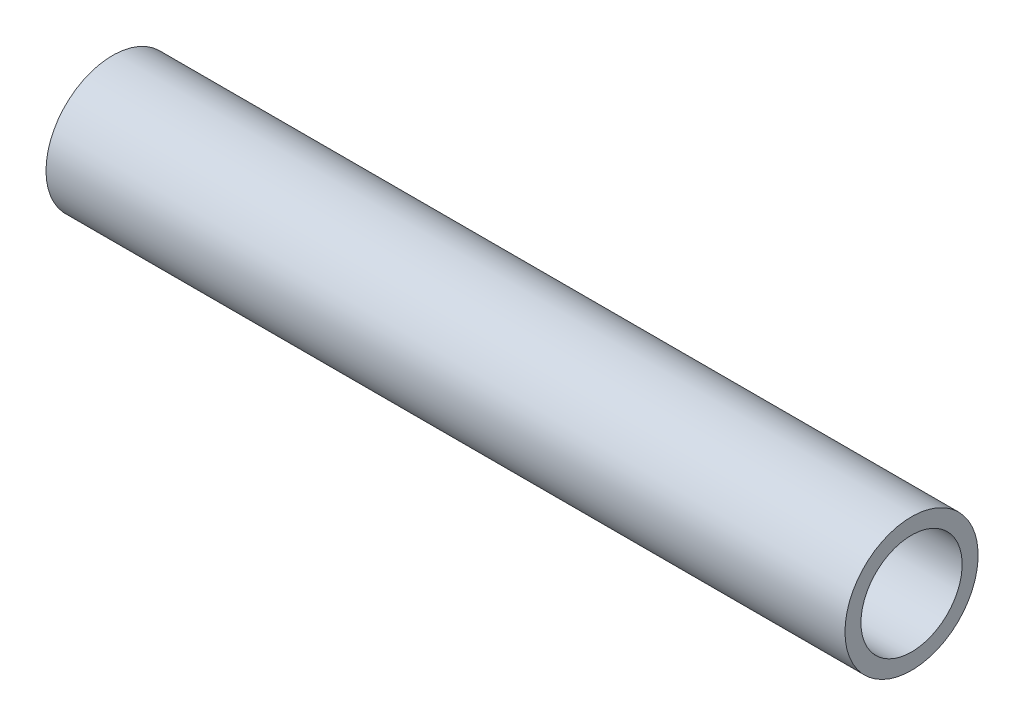
ISO-10303-21;
HEADER;
FILE_DESCRIPTION(('STEP AP214'),'2;1');
FILE_NAME('part.step','',(''),(''),'','','');
FILE_SCHEMA(('AUTOMOTIVE_DESIGN { 1 0 10303 214 1 1 1 1 }'));
ENDSEC;
DATA;
#1=APPLICATION_CONTEXT('core data for automotive mechanical design processes');
#2=APPLICATION_PROTOCOL_DEFINITION('international standard','automotive_design',2000,#1);
#3=PRODUCT_CONTEXT('',#1,'mechanical');
#4=PRODUCT('Part','Part','',(#3));
#5=PRODUCT_RELATED_PRODUCT_CATEGORY('part','',(#4));
#6=PRODUCT_DEFINITION_FORMATION('','',#4);
#7=PRODUCT_DEFINITION_CONTEXT('part definition',#1,'design');
#8=PRODUCT_DEFINITION('design','',#6,#7);
#9=PRODUCT_DEFINITION_SHAPE('','',#8);
#10=(LENGTH_UNIT() NAMED_UNIT(*) SI_UNIT(.MILLI.,.METRE.));
#11=(NAMED_UNIT(*) PLANE_ANGLE_UNIT() SI_UNIT($,.RADIAN.));
#12=(NAMED_UNIT(*) SI_UNIT($,.STERADIAN.) SOLID_ANGLE_UNIT());
#13=UNCERTAINTY_MEASURE_WITH_UNIT(LENGTH_MEASURE(1.E-05),#10,'distance_accuracy_value','');
#14=(GEOMETRIC_REPRESENTATION_CONTEXT(3) GLOBAL_UNCERTAINTY_ASSIGNED_CONTEXT((#13)) GLOBAL_UNIT_ASSIGNED_CONTEXT((#10,
#11,#12)) REPRESENTATION_CONTEXT('',''));
#15=CARTESIAN_POINT('',(0.,0.,0.));
#16=DIRECTION('',(0.,0.,1.));
#17=DIRECTION('',(1.,0.,0.));
#18=AXIS2_PLACEMENT_3D('',#15,#16,#17);
#19=CARTESIAN_POINT('',(152.4,0.,0.));
#20=DIRECTION('',(1.,0.,0.));
#21=DIRECTION('',(0.,0.,-1.));
#22=AXIS2_PLACEMENT_3D('',#19,#20,#21);
#23=PLANE('',#22);
#24=CARTESIAN_POINT('',(152.4,0.,0.));
#25=DIRECTION('',(1.,0.,0.));
#26=DIRECTION('',(0.,0.,-1.));
#27=AXIS2_PLACEMENT_3D('',#24,#25,#26);
#28=CIRCLE('',#27,12.7);
#29=CARTESIAN_POINT('',(152.4,0.,12.7));
#30=VERTEX_POINT('',#29);
#31=EDGE_CURVE('E10',#30,#30,#28,.T.);
#32=ORIENTED_EDGE('',*,*,#31,.T.);
#33=EDGE_LOOP('',(#32));
#34=FACE_BOUND('',#33,.T.);
#35=CARTESIAN_POINT('',(152.4,0.,0.));
#36=DIRECTION('',(1.,0.,0.));
#37=DIRECTION('',(0.,0.,-1.));
#38=AXIS2_PLACEMENT_3D('',#35,#36,#37);
#39=CIRCLE('',#38,9.652);
#40=CARTESIAN_POINT('',(152.4,0.,9.652));
#41=VERTEX_POINT('',#40);
#42=EDGE_CURVE('E50',#41,#41,#39,.T.);
#43=ORIENTED_EDGE('',*,*,#42,.F.);
#44=EDGE_LOOP('',(#43));
#45=FACE_BOUND('',#44,.T.);
#46=ADVANCED_FACE('F36',(#34,#45),#23,.T.);
#47=CARTESIAN_POINT('',(0.,0.,0.));
#48=DIRECTION('',(1.,0.,0.));
#49=DIRECTION('',(0.,0.,-1.));
#50=AXIS2_PLACEMENT_3D('',#47,#48,#49);
#51=PLANE('',#50);
#52=CARTESIAN_POINT('',(0.,0.,0.));
#53=DIRECTION('',(1.,0.,0.));
#54=DIRECTION('',(0.,0.,-1.));
#55=AXIS2_PLACEMENT_3D('',#52,#53,#54);
#56=CIRCLE('',#55,12.7);
#57=CARTESIAN_POINT('',(0.,0.,12.7));
#58=VERTEX_POINT('',#57);
#59=EDGE_CURVE('E40',#58,#58,#56,.T.);
#60=ORIENTED_EDGE('',*,*,#59,.F.);
#61=EDGE_LOOP('',(#60));
#62=FACE_BOUND('',#61,.T.);
#63=CARTESIAN_POINT('',(0.,0.,0.));
#64=DIRECTION('',(1.,0.,0.));
#65=DIRECTION('',(0.,0.,-1.));
#66=AXIS2_PLACEMENT_3D('',#63,#64,#65);
#67=CIRCLE('',#66,9.652);
#68=CARTESIAN_POINT('',(0.,0.,9.652));
#69=VERTEX_POINT('',#68);
#70=EDGE_CURVE('E52',#69,#69,#67,.T.);
#71=ORIENTED_EDGE('',*,*,#70,.T.);
#72=EDGE_LOOP('',(#71));
#73=FACE_BOUND('',#72,.T.);
#74=ADVANCED_FACE('F63',(#62,#73),#51,.F.);
#75=CARTESIAN_POINT('',(152.4,0.,0.));
#76=DIRECTION('',(-1.,0.,0.));
#77=DIRECTION('',(0.,0.,1.));
#78=AXIS2_PLACEMENT_3D('',#75,#76,#77);
#79=CYLINDRICAL_SURFACE('',#78,12.7);
#80=CARTESIAN_POINT('',(152.4,0.,12.7));
#81=CARTESIAN_POINT('',(150.8125,0.,12.7));
#82=CARTESIAN_POINT('',(149.225,0.,12.7));
#83=CARTESIAN_POINT('',(146.05,0.,12.7));
#84=CARTESIAN_POINT('',(144.4625,0.,12.7));
#85=CARTESIAN_POINT('',(141.2875,0.,12.7));
#86=CARTESIAN_POINT('',(139.7,0.,12.7));
#87=CARTESIAN_POINT('',(136.525,0.,12.7));
#88=CARTESIAN_POINT('',(134.9375,0.,12.7));
#89=CARTESIAN_POINT('',(131.7625,0.,12.7));
#90=CARTESIAN_POINT('',(130.175,0.,12.7));
#91=CARTESIAN_POINT('',(127.,0.,12.7));
#92=CARTESIAN_POINT('',(125.4125,0.,12.7));
#93=CARTESIAN_POINT('',(122.2375,0.,12.7));
#94=CARTESIAN_POINT('',(120.65,0.,12.7));
#95=CARTESIAN_POINT('',(117.475,0.,12.7));
#96=CARTESIAN_POINT('',(115.8875,0.,12.7));
#97=CARTESIAN_POINT('',(112.7125,0.,12.7));
#98=CARTESIAN_POINT('',(111.125,0.,12.7));
#99=CARTESIAN_POINT('',(107.95,0.,12.7));
#100=CARTESIAN_POINT('',(106.3625,0.,12.7));
#101=CARTESIAN_POINT('',(103.1875,0.,12.7));
#102=CARTESIAN_POINT('',(101.6,0.,12.7));
#103=CARTESIAN_POINT('',(98.425,0.,12.7));
#104=CARTESIAN_POINT('',(96.8375,0.,12.7));
#105=CARTESIAN_POINT('',(93.6625,0.,12.7));
#106=CARTESIAN_POINT('',(92.075,0.,12.7));
#107=CARTESIAN_POINT('',(88.9,0.,12.7));
#108=CARTESIAN_POINT('',(87.3125,0.,12.7));
#109=CARTESIAN_POINT('',(84.1375,0.,12.7));
#110=CARTESIAN_POINT('',(82.55,0.,12.7));
#111=CARTESIAN_POINT('',(79.375,0.,12.7));
#112=CARTESIAN_POINT('',(77.7875,0.,12.7));
#113=CARTESIAN_POINT('',(74.6125,0.,12.7));
#114=CARTESIAN_POINT('',(73.025,0.,12.7));
#115=CARTESIAN_POINT('',(69.85,0.,12.7));
#116=CARTESIAN_POINT('',(68.2625,0.,12.7));
#117=CARTESIAN_POINT('',(65.0875,0.,12.7));
#118=CARTESIAN_POINT('',(63.5,0.,12.7));
#119=CARTESIAN_POINT('',(60.325,0.,12.7));
#120=CARTESIAN_POINT('',(58.7375,0.,12.7));
#121=CARTESIAN_POINT('',(55.5625,0.,12.7));
#122=CARTESIAN_POINT('',(53.975,0.,12.7));
#123=CARTESIAN_POINT('',(50.8,0.,12.7));
#124=CARTESIAN_POINT('',(49.2125,0.,12.7));
#125=CARTESIAN_POINT('',(46.0375,0.,12.7));
#126=CARTESIAN_POINT('',(44.45,0.,12.7));
#127=CARTESIAN_POINT('',(41.275,0.,12.7));
#128=CARTESIAN_POINT('',(39.6875,0.,12.7));
#129=CARTESIAN_POINT('',(36.5125,0.,12.7));
#130=CARTESIAN_POINT('',(34.925,0.,12.7));
#131=CARTESIAN_POINT('',(31.75,0.,12.7));
#132=CARTESIAN_POINT('',(30.1625,0.,12.7));
#133=CARTESIAN_POINT('',(26.9875,0.,12.7));
#134=CARTESIAN_POINT('',(25.4,0.,12.7));
#135=CARTESIAN_POINT('',(22.225,0.,12.7));
#136=CARTESIAN_POINT('',(20.6375,0.,12.7));
#137=CARTESIAN_POINT('',(17.4625,0.,12.7));
#138=CARTESIAN_POINT('',(15.875,0.,12.7));
#139=CARTESIAN_POINT('',(12.7,0.,12.7));
#140=CARTESIAN_POINT('',(11.1125,0.,12.7));
#141=CARTESIAN_POINT('',(7.93750000000001,0.,12.7));
#142=CARTESIAN_POINT('',(6.35,0.,12.7));
#143=CARTESIAN_POINT('',(3.175,0.,12.7));
#144=CARTESIAN_POINT('',(1.5875,0.,12.7));
#145=CARTESIAN_POINT('',(0.,0.,12.7));
#146=B_SPLINE_CURVE_WITH_KNOTS('',3,(#80,#81,#82,#83,#84,#85,#86,#87,#88,#89,#90,#91,#92,#93,
#94,#95,#96,#97,#98,#99,#100,#101,#102,#103,#104,#105,#106,#107,#108,#109,#110,#111,#112,#113,
#114,#115,#116,#117,#118,#119,#120,#121,#122,#123,#124,#125,#126,#127,#128,#129,#130,#131,#132,
#133,#134,#135,#136,#137,#138,#139,#140,#141,#142,#143,#144,#145),.UNSPECIFIED.,.F.,.F.,(4,2,2,
2,2,2,2,2,2,2,2,2,2,2,2,2,2,2,2,2,2,2,2,2,2,2,2,2,2,2,2,2,4),(0.,4.76249999999998,
9.52499999999998,14.2875,19.05,23.8125,28.575,33.3375,38.1,42.8625,47.625,52.3875,57.15,61.9125,
66.675,71.4375,76.2,80.9625,85.725,90.4875,95.25,100.0125,104.775,109.5375,114.3,119.0625,
123.825,128.5875,133.35,138.1125,142.875,147.6375,152.4),.UNSPECIFIED.);
#147=EDGE_CURVE('BSEAM38',#30,#58,#146,.T.);
#148=ORIENTED_EDGE('',*,*,#31,.F.);
#149=ORIENTED_EDGE('',*,*,#59,.T.);
#150=ORIENTED_EDGE('',*,*,#147,.T.);
#151=ORIENTED_EDGE('',*,*,#147,.F.);
#152=EDGE_LOOP('',(#148,#150,#149,#151));
#153=FACE_BOUND('',#152,.T.);
#154=ADVANCED_FACE('F38',(#153),#79,.T.);
#155=CARTESIAN_POINT('',(152.4,0.,0.));
#156=DIRECTION('',(-1.,0.,0.));
#157=DIRECTION('',(0.,0.,1.));
#158=AXIS2_PLACEMENT_3D('',#155,#156,#157);
#159=CYLINDRICAL_SURFACE('',#158,9.652);
#160=CARTESIAN_POINT('',(152.4,0.,9.652));
#161=CARTESIAN_POINT('',(150.8125,0.,9.652));
#162=CARTESIAN_POINT('',(149.225,0.,9.652));
#163=CARTESIAN_POINT('',(146.05,0.,9.652));
#164=CARTESIAN_POINT('',(144.4625,0.,9.652));
#165=CARTESIAN_POINT('',(141.2875,0.,9.652));
#166=CARTESIAN_POINT('',(139.7,0.,9.652));
#167=CARTESIAN_POINT('',(136.525,0.,9.652));
#168=CARTESIAN_POINT('',(134.9375,0.,9.652));
#169=CARTESIAN_POINT('',(131.7625,0.,9.652));
#170=CARTESIAN_POINT('',(130.175,0.,9.652));
#171=CARTESIAN_POINT('',(127.,0.,9.652));
#172=CARTESIAN_POINT('',(125.4125,0.,9.652));
#173=CARTESIAN_POINT('',(122.2375,0.,9.652));
#174=CARTESIAN_POINT('',(120.65,0.,9.652));
#175=CARTESIAN_POINT('',(117.475,0.,9.652));
#176=CARTESIAN_POINT('',(115.8875,0.,9.652));
#177=CARTESIAN_POINT('',(112.7125,0.,9.652));
#178=CARTESIAN_POINT('',(111.125,0.,9.652));
#179=CARTESIAN_POINT('',(107.95,0.,9.652));
#180=CARTESIAN_POINT('',(106.3625,0.,9.652));
#181=CARTESIAN_POINT('',(103.1875,0.,9.652));
#182=CARTESIAN_POINT('',(101.6,0.,9.652));
#183=CARTESIAN_POINT('',(98.425,0.,9.652));
#184=CARTESIAN_POINT('',(96.8375,0.,9.652));
#185=CARTESIAN_POINT('',(93.6625,0.,9.652));
#186=CARTESIAN_POINT('',(92.075,0.,9.652));
#187=CARTESIAN_POINT('',(88.9,0.,9.652));
#188=CARTESIAN_POINT('',(87.3125,0.,9.652));
#189=CARTESIAN_POINT('',(84.1375,0.,9.652));
#190=CARTESIAN_POINT('',(82.55,0.,9.652));
#191=CARTESIAN_POINT('',(79.375,0.,9.652));
#192=CARTESIAN_POINT('',(77.7875,0.,9.652));
#193=CARTESIAN_POINT('',(74.6125,0.,9.652));
#194=CARTESIAN_POINT('',(73.025,0.,9.652));
#195=CARTESIAN_POINT('',(69.85,0.,9.652));
#196=CARTESIAN_POINT('',(68.2625,0.,9.652));
#197=CARTESIAN_POINT('',(65.0875,0.,9.652));
#198=CARTESIAN_POINT('',(63.5,0.,9.652));
#199=CARTESIAN_POINT('',(60.325,0.,9.652));
#200=CARTESIAN_POINT('',(58.7375,0.,9.652));
#201=CARTESIAN_POINT('',(55.5625,0.,9.652));
#202=CARTESIAN_POINT('',(53.975,0.,9.652));
#203=CARTESIAN_POINT('',(50.8,0.,9.652));
#204=CARTESIAN_POINT('',(49.2125,0.,9.652));
#205=CARTESIAN_POINT('',(46.0375,0.,9.652));
#206=CARTESIAN_POINT('',(44.45,0.,9.652));
#207=CARTESIAN_POINT('',(41.275,0.,9.652));
#208=CARTESIAN_POINT('',(39.6875,0.,9.652));
#209=CARTESIAN_POINT('',(36.5125,0.,9.652));
#210=CARTESIAN_POINT('',(34.925,0.,9.652));
#211=CARTESIAN_POINT('',(31.75,0.,9.652));
#212=CARTESIAN_POINT('',(30.1625,0.,9.652));
#213=CARTESIAN_POINT('',(26.9875,0.,9.652));
#214=CARTESIAN_POINT('',(25.4,0.,9.652));
#215=CARTESIAN_POINT('',(22.225,0.,9.652));
#216=CARTESIAN_POINT('',(20.6375,0.,9.652));
#217=CARTESIAN_POINT('',(17.4625,0.,9.652));
#218=CARTESIAN_POINT('',(15.875,0.,9.652));
#219=CARTESIAN_POINT('',(12.7,0.,9.652));
#220=CARTESIAN_POINT('',(11.1125,0.,9.652));
#221=CARTESIAN_POINT('',(7.93750000000001,0.,9.652));
#222=CARTESIAN_POINT('',(6.35,0.,9.652));
#223=CARTESIAN_POINT('',(3.175,0.,9.652));
#224=CARTESIAN_POINT('',(1.5875,0.,9.652));
#225=CARTESIAN_POINT('',(0.,0.,9.652));
#226=B_SPLINE_CURVE_WITH_KNOTS('',3,(#160,#161,#162,#163,#164,#165,#166,#167,#168,#169,#170,
#171,#172,#173,#174,#175,#176,#177,#178,#179,#180,#181,#182,#183,#184,#185,#186,#187,#188,#189,
#190,#191,#192,#193,#194,#195,#196,#197,#198,#199,#200,#201,#202,#203,#204,#205,#206,#207,#208,
#209,#210,#211,#212,#213,#214,#215,#216,#217,#218,#219,#220,#221,#222,#223,#224,#225),
.UNSPECIFIED.,.F.,.F.,(4,2,2,2,2,2,2,2,2,2,2,2,2,2,2,2,2,2,2,2,2,2,2,2,2,2,2,2,2,2,2,2,4),(0.,
4.7625,9.52500000000001,14.2875,19.05,23.8125,28.575,33.3375,38.1,42.8625,47.625,52.3875,57.15,
61.9125,66.675,71.4375,76.2,80.9625,85.725,90.4875,95.25,100.0125,104.775,109.5375,114.3,
119.0625,123.825,128.5875,133.35,138.1125,142.875,147.6375,152.4),.UNSPECIFIED.);
#227=EDGE_CURVE('BSEAM59',#41,#69,#226,.T.);
#228=ORIENTED_EDGE('',*,*,#42,.T.);
#229=ORIENTED_EDGE('',*,*,#70,.F.);
#230=ORIENTED_EDGE('',*,*,#227,.T.);
#231=ORIENTED_EDGE('',*,*,#227,.F.);
#232=EDGE_LOOP('',(#228,#230,#229,#231));
#233=FACE_BOUND('',#232,.T.);
#234=ADVANCED_FACE('F59',(#233),#159,.F.);
#235=CLOSED_SHELL('',(#46,#74,#154,#234));
#236=MANIFOLD_SOLID_BREP('B2',#235);
#237=ADVANCED_BREP_SHAPE_REPRESENTATION('',(#18,#236),#14);
#238=SHAPE_DEFINITION_REPRESENTATION(#9,#237);
ENDSEC;
END-ISO-10303-21;
